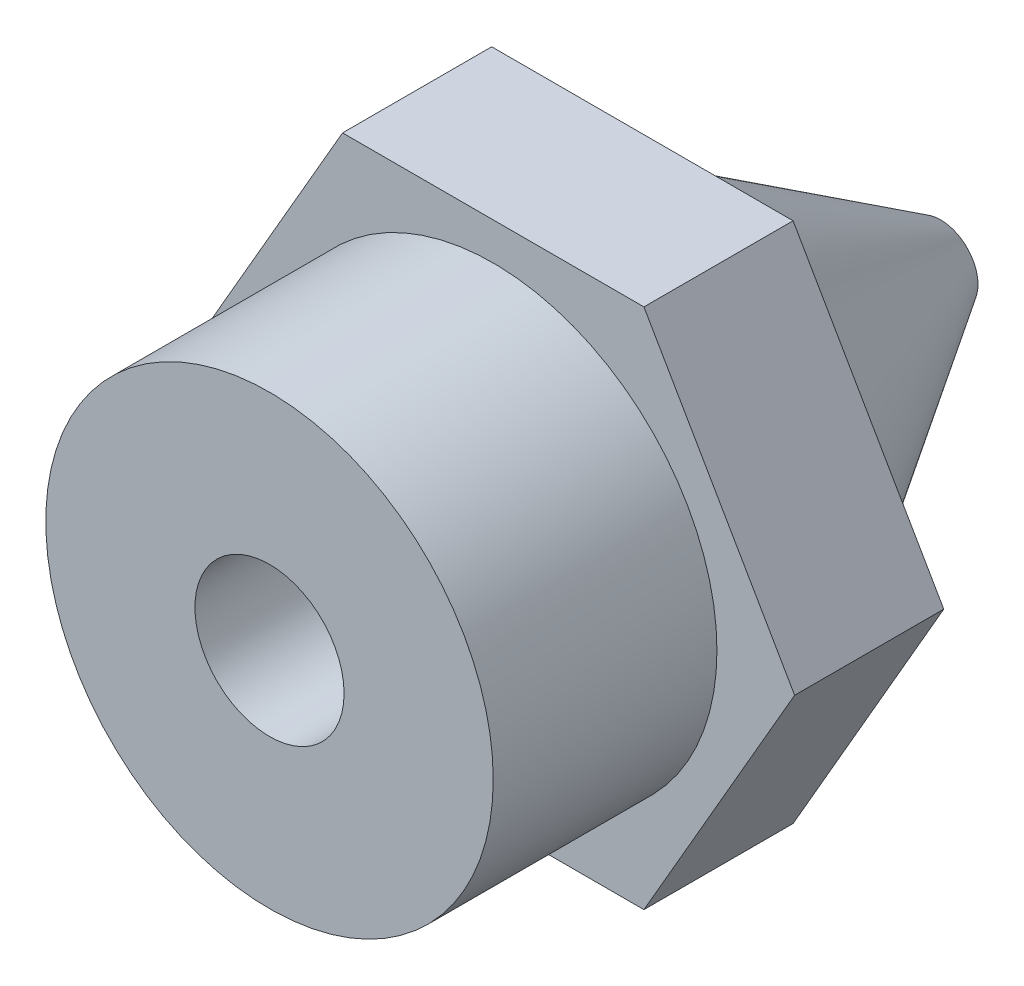
ISO-10303-21;
HEADER;
FILE_DESCRIPTION(('STEP AP214'),'2;1');
FILE_NAME('part.step','',(''),(''),'','','');
FILE_SCHEMA(('AUTOMOTIVE_DESIGN { 1 0 10303 214 1 1 1 1 }'));
ENDSEC;
DATA;
#1=APPLICATION_CONTEXT('core data for automotive mechanical design processes');
#2=APPLICATION_PROTOCOL_DEFINITION('international standard','automotive_design',2000,#1);
#3=PRODUCT_CONTEXT('',#1,'mechanical');
#4=PRODUCT('Part','Part','',(#3));
#5=PRODUCT_RELATED_PRODUCT_CATEGORY('part','',(#4));
#6=PRODUCT_DEFINITION_FORMATION('','',#4);
#7=PRODUCT_DEFINITION_CONTEXT('part definition',#1,'design');
#8=PRODUCT_DEFINITION('design','',#6,#7);
#9=PRODUCT_DEFINITION_SHAPE('','',#8);
#10=(LENGTH_UNIT() NAMED_UNIT(*) SI_UNIT(.MILLI.,.METRE.));
#11=(NAMED_UNIT(*) PLANE_ANGLE_UNIT() SI_UNIT($,.RADIAN.));
#12=(NAMED_UNIT(*) SI_UNIT($,.STERADIAN.) SOLID_ANGLE_UNIT());
#13=UNCERTAINTY_MEASURE_WITH_UNIT(LENGTH_MEASURE(1.E-05),#10,'distance_accuracy_value','');
#14=(GEOMETRIC_REPRESENTATION_CONTEXT(3) GLOBAL_UNCERTAINTY_ASSIGNED_CONTEXT((#13)) GLOBAL_UNIT_ASSIGNED_CONTEXT((#10,
#11,#12)) REPRESENTATION_CONTEXT('',''));
#15=CARTESIAN_POINT('',(0.,0.,0.));
#16=DIRECTION('',(0.,0.,1.));
#17=DIRECTION('',(1.,0.,0.));
#18=AXIS2_PLACEMENT_3D('',#15,#16,#17);
#19=CARTESIAN_POINT('',(2.02072594216368,3.50000000000001,9.));
#20=DIRECTION('',(0.,-1.,0.));
#21=DIRECTION('',(1.,0.,0.));
#22=AXIS2_PLACEMENT_3D('',#19,#20,#21);
#23=PLANE('',#22);
#24=DIRECTION('',(1.,0.,0.));
#25=VECTOR('',#24,1.);
#26=CARTESIAN_POINT('',(2.02072594216368,3.50000000000001,4.));
#27=LINE('',#26,#25);
#28=CARTESIAN_POINT('',(-2.02072594216371,3.49999999999999,4.));
#29=VERTEX_POINT('',#28);
#30=CARTESIAN_POINT('',(2.02072594216368,3.50000000000001,4.));
#31=VERTEX_POINT('',#30);
#32=EDGE_CURVE('E50',#29,#31,#27,.T.);
#33=ORIENTED_EDGE('',*,*,#32,.F.);
#34=DIRECTION('',(0.,0.,-1.));
#35=VECTOR('',#34,1.);
#36=CARTESIAN_POINT('',(-2.02072594216371,3.49999999999999,9.));
#37=LINE('',#36,#35);
#38=CARTESIAN_POINT('',(-2.02072594216371,3.49999999999999,6.));
#39=VERTEX_POINT('',#38);
#40=EDGE_CURVE('E118',#39,#29,#37,.T.);
#41=ORIENTED_EDGE('',*,*,#40,.F.);
#42=DIRECTION('',(-1.,0.,0.));
#43=VECTOR('',#42,1.);
#44=CARTESIAN_POINT('',(2.02072594216368,3.50000000000001,6.));
#45=LINE('',#44,#43);
#46=CARTESIAN_POINT('',(2.02072594216368,3.50000000000001,6.));
#47=VERTEX_POINT('',#46);
#48=EDGE_CURVE('E109',#47,#39,#45,.T.);
#49=ORIENTED_EDGE('',*,*,#48,.F.);
#50=DIRECTION('',(0.,0.,-1.));
#51=VECTOR('',#50,1.);
#52=CARTESIAN_POINT('',(2.02072594216368,3.50000000000001,9.));
#53=LINE('',#52,#51);
#54=EDGE_CURVE('E105',#47,#31,#53,.T.);
#55=ORIENTED_EDGE('',*,*,#54,.T.);
#56=EDGE_LOOP('',(#33,#41,#49,#55));
#57=FACE_BOUND('',#56,.T.);
#58=ADVANCED_FACE('F35',(#57),#23,.F.);
#59=CARTESIAN_POINT('',(-2.02072594216371,3.49999999999999,9.));
#60=DIRECTION('',(0.866025403784441,-0.499999999999995,0.));
#61=DIRECTION('',(0.499999999999995,0.866025403784442,0.));
#62=AXIS2_PLACEMENT_3D('',#59,#60,#61);
#63=PLANE('',#62);
#64=DIRECTION('',(0.499999999999995,0.866025403784442,0.));
#65=VECTOR('',#64,1.);
#66=CARTESIAN_POINT('',(-2.02072594216371,3.49999999999999,4.));
#67=LINE('',#66,#65);
#68=CARTESIAN_POINT('',(-4.04145188432738,0.,4.));
#69=VERTEX_POINT('',#68);
#70=EDGE_CURVE('E141',#69,#29,#67,.T.);
#71=ORIENTED_EDGE('',*,*,#70,.F.);
#72=DIRECTION('',(0.,0.,-1.));
#73=VECTOR('',#72,1.);
#74=CARTESIAN_POINT('',(-4.04145188432738,0.,9.));
#75=LINE('',#74,#73);
#76=CARTESIAN_POINT('',(-4.04145188432738,0.,6.));
#77=VERTEX_POINT('',#76);
#78=EDGE_CURVE('E115',#77,#69,#75,.T.);
#79=ORIENTED_EDGE('',*,*,#78,.F.);
#80=DIRECTION('',(-0.499999999999995,-0.866025403784442,0.));
#81=VECTOR('',#80,1.);
#82=CARTESIAN_POINT('',(-2.02072594216371,3.49999999999999,6.));
#83=LINE('',#82,#81);
#84=EDGE_CURVE('E126',#39,#77,#83,.T.);
#85=ORIENTED_EDGE('',*,*,#84,.F.);
#86=ORIENTED_EDGE('',*,*,#40,.T.);
#87=EDGE_LOOP('',(#71,#79,#85,#86));
#88=FACE_BOUND('',#87,.T.);
#89=ADVANCED_FACE('F178',(#88),#63,.F.);
#90=CARTESIAN_POINT('',(-4.04145188432738,0.,9.));
#91=DIRECTION('',(0.866025403784434,0.500000000000007,0.));
#92=DIRECTION('',(-0.500000000000007,0.866025403784435,0.));
#93=AXIS2_PLACEMENT_3D('',#90,#91,#92);
#94=PLANE('',#93);
#95=DIRECTION('',(-0.500000000000007,0.866025403784435,0.));
#96=VECTOR('',#95,1.);
#97=CARTESIAN_POINT('',(-4.04145188432738,0.,4.));
#98=LINE('',#97,#96);
#99=CARTESIAN_POINT('',(-2.02072594216366,-3.50000000000002,4.));
#100=VERTEX_POINT('',#99);
#101=EDGE_CURVE('E143',#100,#69,#98,.T.);
#102=ORIENTED_EDGE('',*,*,#101,.F.);
#103=DIRECTION('',(0.,0.,-1.));
#104=VECTOR('',#103,1.);
#105=CARTESIAN_POINT('',(-2.02072594216366,-3.50000000000002,9.));
#106=LINE('',#105,#104);
#107=CARTESIAN_POINT('',(-2.02072594216366,-3.50000000000002,6.));
#108=VERTEX_POINT('',#107);
#109=EDGE_CURVE('E107',#108,#100,#106,.T.);
#110=ORIENTED_EDGE('',*,*,#109,.F.);
#111=DIRECTION('',(0.500000000000007,-0.866025403784435,0.));
#112=VECTOR('',#111,1.);
#113=CARTESIAN_POINT('',(-4.04145188432738,0.,6.));
#114=LINE('',#113,#112);
#115=EDGE_CURVE('E127',#77,#108,#114,.T.);
#116=ORIENTED_EDGE('',*,*,#115,.F.);
#117=ORIENTED_EDGE('',*,*,#78,.T.);
#118=EDGE_LOOP('',(#102,#110,#116,#117));
#119=FACE_BOUND('',#118,.T.);
#120=ADVANCED_FACE('F182',(#119),#94,.F.);
#121=CARTESIAN_POINT('',(-2.02072594216366,-3.50000000000002,9.));
#122=DIRECTION('',(0.,1.,0.));
#123=DIRECTION('',(-1.,0.,0.));
#124=AXIS2_PLACEMENT_3D('',#121,#122,#123);
#125=PLANE('',#124);
#126=DIRECTION('',(-1.,0.,0.));
#127=VECTOR('',#126,1.);
#128=CARTESIAN_POINT('',(-2.02072594216366,-3.50000000000002,4.));
#129=LINE('',#128,#127);
#130=CARTESIAN_POINT('',(2.02072594216373,-3.49999999999998,4.));
#131=VERTEX_POINT('',#130);
#132=EDGE_CURVE('E101',#131,#100,#129,.T.);
#133=ORIENTED_EDGE('',*,*,#132,.F.);
#134=DIRECTION('',(0.,0.,-1.));
#135=VECTOR('',#134,1.);
#136=CARTESIAN_POINT('',(2.02072594216373,-3.49999999999998,9.));
#137=LINE('',#136,#135);
#138=CARTESIAN_POINT('',(2.02072594216373,-3.49999999999998,6.));
#139=VERTEX_POINT('',#138);
#140=EDGE_CURVE('E100',#139,#131,#137,.T.);
#141=ORIENTED_EDGE('',*,*,#140,.F.);
#142=DIRECTION('',(1.,0.,0.));
#143=VECTOR('',#142,1.);
#144=CARTESIAN_POINT('',(-2.02072594216366,-3.50000000000002,6.));
#145=LINE('',#144,#143);
#146=EDGE_CURVE('E131',#108,#139,#145,.T.);
#147=ORIENTED_EDGE('',*,*,#146,.F.);
#148=ORIENTED_EDGE('',*,*,#109,.T.);
#149=EDGE_LOOP('',(#133,#141,#147,#148));
#150=FACE_BOUND('',#149,.T.);
#151=ADVANCED_FACE('F188',(#150),#125,.F.);
#152=CARTESIAN_POINT('',(2.02072594216373,-3.49999999999998,9.));
#153=DIRECTION('',(-0.866025403784442,0.499999999999995,0.));
#154=DIRECTION('',(-0.499999999999995,-0.866025403784442,0.));
#155=AXIS2_PLACEMENT_3D('',#152,#153,#154);
#156=PLANE('',#155);
#157=DIRECTION('',(-0.499999999999995,-0.866025403784442,0.));
#158=VECTOR('',#157,1.);
#159=CARTESIAN_POINT('',(2.02072594216373,-3.49999999999998,4.));
#160=LINE('',#159,#158);
#161=CARTESIAN_POINT('',(4.04145188432738,0.,4.));
#162=VERTEX_POINT('',#161);
#163=EDGE_CURVE('E87',#162,#131,#160,.T.);
#164=ORIENTED_EDGE('',*,*,#163,.F.);
#165=DIRECTION('',(0.,0.,-1.));
#166=VECTOR('',#165,1.);
#167=CARTESIAN_POINT('',(4.04145188432738,0.,9.));
#168=LINE('',#167,#166);
#169=CARTESIAN_POINT('',(4.04145188432738,0.,6.));
#170=VERTEX_POINT('',#169);
#171=EDGE_CURVE('E98',#170,#162,#168,.T.);
#172=ORIENTED_EDGE('',*,*,#171,.F.);
#173=DIRECTION('',(0.499999999999995,0.866025403784442,0.));
#174=VECTOR('',#173,1.);
#175=CARTESIAN_POINT('',(2.02072594216373,-3.49999999999998,6.));
#176=LINE('',#175,#174);
#177=EDGE_CURVE('E58',#139,#170,#176,.T.);
#178=ORIENTED_EDGE('',*,*,#177,.F.);
#179=ORIENTED_EDGE('',*,*,#140,.T.);
#180=EDGE_LOOP('',(#164,#172,#178,#179));
#181=FACE_BOUND('',#180,.T.);
#182=ADVANCED_FACE('F97',(#181),#156,.F.);
#183=CARTESIAN_POINT('',(4.04145188432738,0.,9.));
#184=DIRECTION('',(-0.866025403784438,-0.500000000000001,0.));
#185=DIRECTION('',(0.500000000000001,-0.866025403784438,0.));
#186=AXIS2_PLACEMENT_3D('',#183,#184,#185);
#187=PLANE('',#186);
#188=DIRECTION('',(0.500000000000001,-0.866025403784438,0.));
#189=VECTOR('',#188,1.);
#190=CARTESIAN_POINT('',(4.04145188432738,0.,4.));
#191=LINE('',#190,#189);
#192=EDGE_CURVE('E43',#31,#162,#191,.T.);
#193=ORIENTED_EDGE('',*,*,#192,.F.);
#194=ORIENTED_EDGE('',*,*,#54,.F.);
#195=DIRECTION('',(-0.500000000000001,0.866025403784438,0.));
#196=VECTOR('',#195,1.);
#197=CARTESIAN_POINT('',(4.04145188432738,0.,6.));
#198=LINE('',#197,#196);
#199=EDGE_CURVE('E93',#170,#47,#198,.T.);
#200=ORIENTED_EDGE('',*,*,#199,.F.);
#201=ORIENTED_EDGE('',*,*,#171,.T.);
#202=EDGE_LOOP('',(#193,#194,#200,#201));
#203=FACE_BOUND('',#202,.T.);
#204=ADVANCED_FACE('F104',(#203),#187,.F.);
#205=CARTESIAN_POINT('',(0.,0.,6.));
#206=DIRECTION('',(0.,0.,1.));
#207=DIRECTION('',(1.,0.,0.));
#208=AXIS2_PLACEMENT_3D('',#205,#206,#207);
#209=PLANE('',#208);
#210=CARTESIAN_POINT('',(0.,0.,6.));
#211=DIRECTION('',(0.,0.,1.));
#212=DIRECTION('',(1.,0.,0.));
#213=AXIS2_PLACEMENT_3D('',#210,#211,#212);
#214=CIRCLE('',#213,3.);
#215=CARTESIAN_POINT('',(3.,0.,6.));
#216=VERTEX_POINT('',#215);
#217=EDGE_CURVE('E134',#216,#216,#214,.T.);
#218=ORIENTED_EDGE('',*,*,#217,.F.);
#219=EDGE_LOOP('',(#218));
#220=FACE_BOUND('',#219,.T.);
#221=ORIENTED_EDGE('',*,*,#48,.T.);
#222=ORIENTED_EDGE('',*,*,#84,.T.);
#223=ORIENTED_EDGE('',*,*,#115,.T.);
#224=ORIENTED_EDGE('',*,*,#146,.T.);
#225=ORIENTED_EDGE('',*,*,#177,.T.);
#226=ORIENTED_EDGE('',*,*,#199,.T.);
#227=EDGE_LOOP('',(#221,#222,#223,#224,#225,#226));
#228=FACE_BOUND('',#227,.T.);
#229=ADVANCED_FACE('F122',(#220,#228),#209,.T.);
#230=CARTESIAN_POINT('',(0.,0.,6.));
#231=DIRECTION('',(0.,0.,1.));
#232=DIRECTION('',(1.,0.,0.));
#233=AXIS2_PLACEMENT_3D('',#230,#231,#232);
#234=CYLINDRICAL_SURFACE('',#233,3.);
#235=ORIENTED_EDGE('',*,*,#217,.T.);
#236=EDGE_LOOP('',(#235));
#237=FACE_BOUND('',#236,.T.);
#238=CARTESIAN_POINT('',(0.,0.,9.));
#239=DIRECTION('',(0.,0.,1.));
#240=DIRECTION('',(1.,0.,0.));
#241=AXIS2_PLACEMENT_3D('',#238,#239,#240);
#242=CIRCLE('',#241,3.);
#243=CARTESIAN_POINT('',(3.,0.,9.));
#244=VERTEX_POINT('',#243);
#245=EDGE_CURVE('E135',#244,#244,#242,.T.);
#246=ORIENTED_EDGE('',*,*,#245,.F.);
#247=EDGE_LOOP('',(#246));
#248=FACE_BOUND('',#247,.T.);
#249=ADVANCED_FACE('F163',(#237,#248),#234,.T.);
#250=CARTESIAN_POINT('',(0.,0.,9.));
#251=DIRECTION('',(0.,0.,1.));
#252=DIRECTION('',(1.,0.,0.));
#253=AXIS2_PLACEMENT_3D('',#250,#251,#252);
#254=PLANE('',#253);
#255=CARTESIAN_POINT('',(0.,0.,9.));
#256=DIRECTION('',(0.,0.,1.));
#257=DIRECTION('',(1.,0.,0.));
#258=AXIS2_PLACEMENT_3D('',#255,#256,#257);
#259=CIRCLE('',#258,1.);
#260=CARTESIAN_POINT('',(1.,0.,9.));
#261=VERTEX_POINT('',#260);
#262=EDGE_CURVE('E154',#261,#261,#259,.T.);
#263=ORIENTED_EDGE('',*,*,#262,.F.);
#264=EDGE_LOOP('',(#263));
#265=FACE_BOUND('',#264,.T.);
#266=ORIENTED_EDGE('',*,*,#245,.T.);
#267=EDGE_LOOP('',(#266));
#268=FACE_BOUND('',#267,.T.);
#269=ADVANCED_FACE('F160',(#265,#268),#254,.T.);
#270=CARTESIAN_POINT('',(0.,0.,4.));
#271=DIRECTION('',(0.,0.,-1.));
#272=DIRECTION('',(-1.,0.,0.));
#273=AXIS2_PLACEMENT_3D('',#270,#271,#272);
#274=PLANE('',#273);
#275=CARTESIAN_POINT('',(0.,0.,4.));
#276=DIRECTION('',(0.,0.,-1.));
#277=DIRECTION('',(-1.,0.,0.));
#278=AXIS2_PLACEMENT_3D('',#275,#276,#277);
#279=CIRCLE('',#278,3.);
#280=CARTESIAN_POINT('',(2.99999999999998,0.,4.));
#281=VERTEX_POINT('',#280);
#282=EDGE_CURVE('E102',#281,#281,#279,.T.);
#283=ORIENTED_EDGE('',*,*,#282,.F.);
#284=EDGE_LOOP('',(#283));
#285=FACE_BOUND('',#284,.T.);
#286=ORIENTED_EDGE('',*,*,#32,.T.);
#287=ORIENTED_EDGE('',*,*,#192,.T.);
#288=ORIENTED_EDGE('',*,*,#163,.T.);
#289=ORIENTED_EDGE('',*,*,#132,.T.);
#290=ORIENTED_EDGE('',*,*,#101,.T.);
#291=ORIENTED_EDGE('',*,*,#70,.T.);
#292=EDGE_LOOP('',(#286,#287,#288,#289,#290,#291));
#293=FACE_BOUND('',#292,.T.);
#294=ADVANCED_FACE('F86',(#285,#293),#274,.T.);
#295=CARTESIAN_POINT('',(0.,0.,0.));
#296=DIRECTION('',(0.,0.,1.));
#297=DIRECTION('',(1.,0.,0.));
#298=AXIS2_PLACEMENT_3D('',#295,#296,#297);
#299=PLANE('',#298);
#300=CARTESIAN_POINT('',(0.,0.,0.));
#301=DIRECTION('',(0.,0.,1.));
#302=DIRECTION('',(1.,0.,0.));
#303=AXIS2_PLACEMENT_3D('',#300,#301,#302);
#304=CIRCLE('',#303,0.200000000000001);
#305=CARTESIAN_POINT('',(0.2,0.,0.));
#306=VERTEX_POINT('',#305);
#307=EDGE_CURVE('E148',#306,#306,#304,.T.);
#308=ORIENTED_EDGE('',*,*,#307,.T.);
#309=EDGE_LOOP('',(#308));
#310=FACE_BOUND('',#309,.T.);
#311=CARTESIAN_POINT('',(0.,0.,0.));
#312=DIRECTION('',(0.,0.,1.));
#313=DIRECTION('',(1.,0.,0.));
#314=AXIS2_PLACEMENT_3D('',#311,#312,#313);
#315=CIRCLE('',#314,0.500522592362688);
#316=CARTESIAN_POINT('',(0.500522592362688,0.,0.));
#317=VERTEX_POINT('',#316);
#318=EDGE_CURVE('E11',#317,#317,#315,.F.);
#319=ORIENTED_EDGE('',*,*,#318,.T.);
#320=EDGE_LOOP('',(#319));
#321=FACE_BOUND('',#320,.T.);
#322=ADVANCED_FACE('F197',(#310,#321),#299,.F.);
#323=CARTESIAN_POINT('',(0.,0.,0.));
#324=DIRECTION('',(0.,0.,1.));
#325=DIRECTION('',(1.,0.,0.));
#326=AXIS2_PLACEMENT_3D('',#323,#324,#325);
#327=CONICAL_SURFACE('',#326,0.500522592362688,0.558505360638183);
#328=CARTESIAN_POINT('',(2.99999999999998,0.,4.));
#329=CARTESIAN_POINT('',(2.97396377700376,0.,3.95833333333333));
#330=CARTESIAN_POINT('',(2.94792755400754,0.,3.91666666666667));
#331=CARTESIAN_POINT('',(2.8958551080151,0.,3.83333333333333));
#332=CARTESIAN_POINT('',(2.86981888501887,0.,3.79166666666667));
#333=CARTESIAN_POINT('',(2.81774643902643,0.,3.70833333333333));
#334=CARTESIAN_POINT('',(2.79171021603021,0.,3.66666666666667));
#335=CARTESIAN_POINT('',(2.73963777003777,0.,3.58333333333333));
#336=CARTESIAN_POINT('',(2.71360154704154,0.,3.54166666666667));
#337=CARTESIAN_POINT('',(2.6615291010491,0.,3.45833333333333));
#338=CARTESIAN_POINT('',(2.63549287805288,0.,3.41666666666667));
#339=CARTESIAN_POINT('',(2.58342043206043,0.,3.33333333333333));
#340=CARTESIAN_POINT('',(2.55738420906421,0.,3.29166666666667));
#341=CARTESIAN_POINT('',(2.50531176307177,0.,3.20833333333333));
#342=CARTESIAN_POINT('',(2.47927554007555,0.,3.16666666666667));
#343=CARTESIAN_POINT('',(2.4272030940831,0.,3.08333333333333));
#344=CARTESIAN_POINT('',(2.40116687108688,0.,3.04166666666667));
#345=CARTESIAN_POINT('',(2.34909442509444,0.,2.95833333333333));
#346=CARTESIAN_POINT('',(2.32305820209822,0.,2.91666666666667));
#347=CARTESIAN_POINT('',(2.27098575610577,0.,2.83333333333333));
#348=CARTESIAN_POINT('',(2.24494953310955,0.,2.79166666666667));
#349=CARTESIAN_POINT('',(2.19287708711711,0.,2.70833333333333));
#350=CARTESIAN_POINT('',(2.16684086412088,0.,2.66666666666667));
#351=CARTESIAN_POINT('',(2.11476841812844,0.,2.58333333333333));
#352=CARTESIAN_POINT('',(2.08873219513222,0.,2.54166666666667));
#353=CARTESIAN_POINT('',(2.03665974913978,0.,2.45833333333333));
#354=CARTESIAN_POINT('',(2.01062352614355,0.,2.41666666666667));
#355=CARTESIAN_POINT('',(1.95855108015111,0.,2.33333333333333));
#356=CARTESIAN_POINT('',(1.93251485715489,0.,2.29166666666667));
#357=CARTESIAN_POINT('',(1.88044241116245,0.,2.20833333333333));
#358=CARTESIAN_POINT('',(1.85440618816622,0.,2.16666666666667));
#359=CARTESIAN_POINT('',(1.80233374217378,0.,2.08333333333333));
#360=CARTESIAN_POINT('',(1.77629751917756,0.,2.04166666666667));
#361=CARTESIAN_POINT('',(1.72422507318511,0.,1.95833333333333));
#362=CARTESIAN_POINT('',(1.69818885018889,0.,1.91666666666667));
#363=CARTESIAN_POINT('',(1.64611640419645,0.,1.83333333333333));
#364=CARTESIAN_POINT('',(1.62008018120023,0.,1.79166666666667));
#365=CARTESIAN_POINT('',(1.56800773520778,0.,1.70833333333333));
#366=CARTESIAN_POINT('',(1.54197151221156,0.,1.66666666666667));
#367=CARTESIAN_POINT('',(1.48989906621912,0.,1.58333333333333));
#368=CARTESIAN_POINT('',(1.4638628432229,0.,1.54166666666667));
#369=CARTESIAN_POINT('',(1.41179039723045,0.,1.45833333333333));
#370=CARTESIAN_POINT('',(1.38575417423423,0.,1.41666666666667));
#371=CARTESIAN_POINT('',(1.33368172824179,0.,1.33333333333333));
#372=CARTESIAN_POINT('',(1.30764550524556,0.,1.29166666666667));
#373=CARTESIAN_POINT('',(1.25557305925312,0.,1.20833333333333));
#374=CARTESIAN_POINT('',(1.2295368362569,0.,1.16666666666667));
#375=CARTESIAN_POINT('',(1.17746439026446,0.,1.08333333333333));
#376=CARTESIAN_POINT('',(1.15142816726823,0.,1.04166666666667));
#377=CARTESIAN_POINT('',(1.09935572127579,0.,0.958333333333333));
#378=CARTESIAN_POINT('',(1.07331949827957,0.,0.916666666666667));
#379=CARTESIAN_POINT('',(1.02124705228712,0.,0.833333333333333));
#380=CARTESIAN_POINT('',(0.995210829290903,0.,0.791666666666667));
#381=CARTESIAN_POINT('',(0.943138383298459,0.,0.708333333333333));
#382=CARTESIAN_POINT('',(0.917102160302237,0.,0.666666666666667));
#383=CARTESIAN_POINT('',(0.865029714309794,0.,0.583333333333333));
#384=CARTESIAN_POINT('',(0.838993491313572,0.,0.541666666666667));
#385=CARTESIAN_POINT('',(0.786921045321128,0.,0.458333333333333));
#386=CARTESIAN_POINT('',(0.760884822324907,0.,0.416666666666667));
#387=CARTESIAN_POINT('',(0.708812376332463,0.,0.333333333333333));
#388=CARTESIAN_POINT('',(0.682776153336241,0.,0.291666666666667));
#389=CARTESIAN_POINT('',(0.630703707343798,0.,0.208333333333333));
#390=CARTESIAN_POINT('',(0.604667484347576,0.,0.166666666666667));
#391=CARTESIAN_POINT('',(0.552595038355132,0.,0.0833333333333335));
#392=CARTESIAN_POINT('',(0.52655881535891,0.,0.0416666666666668));
#393=CARTESIAN_POINT('',(0.500522592362688,0.,0.));
#394=B_SPLINE_CURVE_WITH_KNOTS('',3,(#328,#329,#330,#331,#332,#333,#334,#335,#336,#337,#338,
#339,#340,#341,#342,#343,#344,#345,#346,#347,#348,#349,#350,#351,#352,#353,#354,#355,#356,#357,
#358,#359,#360,#361,#362,#363,#364,#365,#366,#367,#368,#369,#370,#371,#372,#373,#374,#375,#376,
#377,#378,#379,#380,#381,#382,#383,#384,#385,#386,#387,#388,#389,#390,#391,#392,#393),
.UNSPECIFIED.,.F.,.F.,(4,2,2,2,2,2,2,2,2,2,2,2,2,2,2,2,2,2,2,2,2,2,2,2,2,2,2,2,2,2,2,2,4),(0.,
0.147397300420262,0.294794600840524,0.442191901260785,0.589589201681047,0.736986502101309,
0.884383802521571,1.03178110294183,1.17917840336209,1.32657570378236,1.47397300420262,
1.62137030462288,1.76876760504314,1.9161649054634,2.06356220588366,2.21095950630393,
2.35835680672419,2.50575410714445,2.65315140756471,2.80054870798497,2.94794600840524,
3.0953433088255,3.24274060924576,3.39013790966602,3.53753521008628,3.68493251050655,
3.83232981092681,3.97972711134707,4.12712441176733,4.27452171218759,4.42191901260786,
4.56931631302812,4.71671361344838),.UNSPECIFIED.);
#395=EDGE_CURVE('BSEAM37',#281,#317,#394,.T.);
#396=ORIENTED_EDGE('',*,*,#282,.T.);
#397=ORIENTED_EDGE('',*,*,#318,.F.);
#398=ORIENTED_EDGE('',*,*,#395,.T.);
#399=ORIENTED_EDGE('',*,*,#395,.F.);
#400=EDGE_LOOP('',(#396,#398,#397,#399));
#401=FACE_BOUND('',#400,.T.);
#402=ADVANCED_FACE('F37',(#401),#327,.T.);
#403=CARTESIAN_POINT('',(0.,0.,6.51547714238003));
#404=DIRECTION('',(0.,0.,1.));
#405=DIRECTION('',(1.,0.,0.));
#406=AXIS2_PLACEMENT_3D('',#403,#404,#405);
#407=CONICAL_SURFACE('',#406,1.,0.122173047639597);
#408=CARTESIAN_POINT('',(0.,0.,6.51547714238003));
#409=DIRECTION('',(0.,0.,1.));
#410=DIRECTION('',(1.,0.,0.));
#411=AXIS2_PLACEMENT_3D('',#408,#409,#410);
#412=CIRCLE('',#411,1.);
#413=CARTESIAN_POINT('',(1.,0.,6.51547714238003));
#414=VERTEX_POINT('',#413);
#415=EDGE_CURVE('E151',#414,#414,#412,.T.);
#416=CARTESIAN_POINT('',(0.2,0.,0.));
#417=CARTESIAN_POINT('',(0.208333333333333,0.,0.0678695535664579));
#418=CARTESIAN_POINT('',(0.216666666666667,0.,0.135739107132917));
#419=CARTESIAN_POINT('',(0.233333333333333,0.,0.271478214265834));
#420=CARTESIAN_POINT('',(0.241666666666667,0.,0.339347767832292));
#421=CARTESIAN_POINT('',(0.258333333333333,0.,0.47508687496521));
#422=CARTESIAN_POINT('',(0.266666666666667,0.,0.542956428531669));
#423=CARTESIAN_POINT('',(0.283333333333333,0.,0.678695535664586));
#424=CARTESIAN_POINT('',(0.291666666666667,0.,0.746565089231045));
#425=CARTESIAN_POINT('',(0.308333333333334,0.,0.882304196363962));
#426=CARTESIAN_POINT('',(0.316666666666667,0.,0.950173749930421));
#427=CARTESIAN_POINT('',(0.333333333333334,0.,1.08591285706334));
#428=CARTESIAN_POINT('',(0.341666666666667,0.,1.1537824106298));
#429=CARTESIAN_POINT('',(0.358333333333334,0.,1.28952151776271));
#430=CARTESIAN_POINT('',(0.366666666666667,0.,1.35739107132917));
#431=CARTESIAN_POINT('',(0.383333333333334,0.,1.49313017846209));
#432=CARTESIAN_POINT('',(0.391666666666667,0.,1.56099973202855));
#433=CARTESIAN_POINT('',(0.408333333333334,0.,1.69673883916147));
#434=CARTESIAN_POINT('',(0.416666666666667,0.,1.76460839272793));
#435=CARTESIAN_POINT('',(0.433333333333334,0.,1.90034749986084));
#436=CARTESIAN_POINT('',(0.441666666666667,0.,1.9682170534273));
#437=CARTESIAN_POINT('',(0.458333333333334,0.,2.10395616056022));
#438=CARTESIAN_POINT('',(0.466666666666667,0.,2.17182571412668));
#439=CARTESIAN_POINT('',(0.483333333333334,0.,2.30756482125959));
#440=CARTESIAN_POINT('',(0.491666666666667,0.,2.37543437482605));
#441=CARTESIAN_POINT('',(0.508333333333334,0.,2.51117348195897));
#442=CARTESIAN_POINT('',(0.516666666666667,0.,2.57904303552543));
#443=CARTESIAN_POINT('',(0.533333333333334,0.,2.71478214265835));
#444=CARTESIAN_POINT('',(0.541666666666667,0.,2.78265169622481));
#445=CARTESIAN_POINT('',(0.558333333333334,0.,2.91839080335772));
#446=CARTESIAN_POINT('',(0.566666666666667,0.,2.98626035692418));
#447=CARTESIAN_POINT('',(0.583333333333334,0.,3.1219994640571));
#448=CARTESIAN_POINT('',(0.591666666666667,0.,3.18986901762356));
#449=CARTESIAN_POINT('',(0.608333333333334,0.,3.32560812475648));
#450=CARTESIAN_POINT('',(0.616666666666667,0.,3.39347767832293));
#451=CARTESIAN_POINT('',(0.633333333333334,0.,3.52921678545585));
#452=CARTESIAN_POINT('',(0.641666666666667,0.,3.59708633902231));
#453=CARTESIAN_POINT('',(0.658333333333334,0.,3.73282544615523));
#454=CARTESIAN_POINT('',(0.666666666666667,0.,3.80069499972169));
#455=CARTESIAN_POINT('',(0.683333333333334,0.,3.9364341068546));
#456=CARTESIAN_POINT('',(0.691666666666667,0.,4.00430366042106));
#457=CARTESIAN_POINT('',(0.708333333333334,0.,4.14004276755398));
#458=CARTESIAN_POINT('',(0.716666666666667,0.,4.20791232112044));
#459=CARTESIAN_POINT('',(0.733333333333334,0.,4.34365142825336));
#460=CARTESIAN_POINT('',(0.741666666666667,0.,4.41152098181981));
#461=CARTESIAN_POINT('',(0.758333333333334,0.,4.54726008895273));
#462=CARTESIAN_POINT('',(0.766666666666667,0.,4.61512964251919));
#463=CARTESIAN_POINT('',(0.783333333333334,0.,4.75086874965211));
#464=CARTESIAN_POINT('',(0.791666666666667,0.,4.81873830321857));
#465=CARTESIAN_POINT('',(0.808333333333334,0.,4.95447741035148));
#466=CARTESIAN_POINT('',(0.816666666666667,0.,5.02234696391794));
#467=CARTESIAN_POINT('',(0.833333333333334,0.,5.15808607105086));
#468=CARTESIAN_POINT('',(0.841666666666667,0.,5.22595562461732));
#469=CARTESIAN_POINT('',(0.858333333333334,0.,5.36169473175024));
#470=CARTESIAN_POINT('',(0.866666666666667,0.,5.42956428531669));
#471=CARTESIAN_POINT('',(0.883333333333334,0.,5.56530339244961));
#472=CARTESIAN_POINT('',(0.891666666666667,0.,5.63317294601607));
#473=CARTESIAN_POINT('',(0.908333333333334,0.,5.76891205314899));
#474=CARTESIAN_POINT('',(0.916666666666667,0.,5.83678160671545));
#475=CARTESIAN_POINT('',(0.933333333333334,0.,5.97252071384837));
#476=CARTESIAN_POINT('',(0.941666666666667,0.,6.04039026741482));
#477=CARTESIAN_POINT('',(0.958333333333334,0.,6.17612937454774));
#478=CARTESIAN_POINT('',(0.966666666666668,0.,6.2439989281142));
#479=CARTESIAN_POINT('',(0.983333333333334,0.,6.37973803524712));
#480=CARTESIAN_POINT('',(0.991666666666668,0.,6.44760758881358));
#481=CARTESIAN_POINT('',(1.,0.,6.51547714238003));
#482=B_SPLINE_CURVE_WITH_KNOTS('',3,(#416,#417,#418,#419,#420,#421,#422,#423,#424,#425,#426,
#427,#428,#429,#430,#431,#432,#433,#434,#435,#436,#437,#438,#439,#440,#441,#442,#443,#444,#445,
#446,#447,#448,#449,#450,#451,#452,#453,#454,#455,#456,#457,#458,#459,#460,#461,#462,#463,#464,
#465,#466,#467,#468,#469,#470,#471,#472,#473,#474,#475,#476,#477,#478,#479,#480,#481),
.UNSPECIFIED.,.F.,.F.,(4,2,2,2,2,2,2,2,2,2,2,2,2,2,2,2,2,2,2,2,2,2,2,2,2,2,2,2,2,2,2,2,4),(0.,
0.205137726203138,0.410275452406276,0.615413178609414,0.820550904812553,1.02568863101569,
1.23082635721883,1.43596408342197,1.64110180962511,1.84623953582824,2.05137726203138,
2.25651498823452,2.46165271443766,2.6667904406408,2.87192816684393,3.07706589304707,
3.28220361925021,3.48734134545335,3.69247907165649,3.89761679785962,4.10275452406276,
4.3078922502659,4.51302997646904,4.71816770267218,4.92330542887532,5.12844315507845,
5.33358088128159,5.53871860748473,5.74385633368787,5.94899405989101,6.15413178609415,
6.35926951229728,6.56440723850042),.UNSPECIFIED.);
#483=EDGE_CURVE('BSEAM204',#306,#414,#482,.T.);
#484=ORIENTED_EDGE('',*,*,#307,.F.);
#485=ORIENTED_EDGE('',*,*,#415,.T.);
#486=ORIENTED_EDGE('',*,*,#483,.T.);
#487=ORIENTED_EDGE('',*,*,#483,.F.);
#488=EDGE_LOOP('',(#484,#486,#485,#487));
#489=FACE_BOUND('',#488,.T.);
#490=ADVANCED_FACE('F204',(#489),#407,.F.);
#491=CARTESIAN_POINT('',(0.,0.,10.3816051571313));
#492=DIRECTION('',(0.,0.,1.));
#493=DIRECTION('',(1.,0.,0.));
#494=AXIS2_PLACEMENT_3D('',#491,#492,#493);
#495=CYLINDRICAL_SURFACE('',#494,1.);
#496=ORIENTED_EDGE('',*,*,#415,.F.);
#497=EDGE_LOOP('',(#496));
#498=FACE_BOUND('',#497,.T.);
#499=ORIENTED_EDGE('',*,*,#262,.T.);
#500=EDGE_LOOP('',(#499));
#501=FACE_BOUND('',#500,.T.);
#502=ADVANCED_FACE('F158',(#498,#501),#495,.F.);
#503=CLOSED_SHELL('',(#58,#89,#120,#151,#182,#204,#229,#249,#269,#294,#322,#402,#490,#502));
#504=MANIFOLD_SOLID_BREP('B2',#503);
#505=ADVANCED_BREP_SHAPE_REPRESENTATION('',(#18,#504),#14);
#506=SHAPE_DEFINITION_REPRESENTATION(#9,#505);
ENDSEC;
END-ISO-10303-21;
